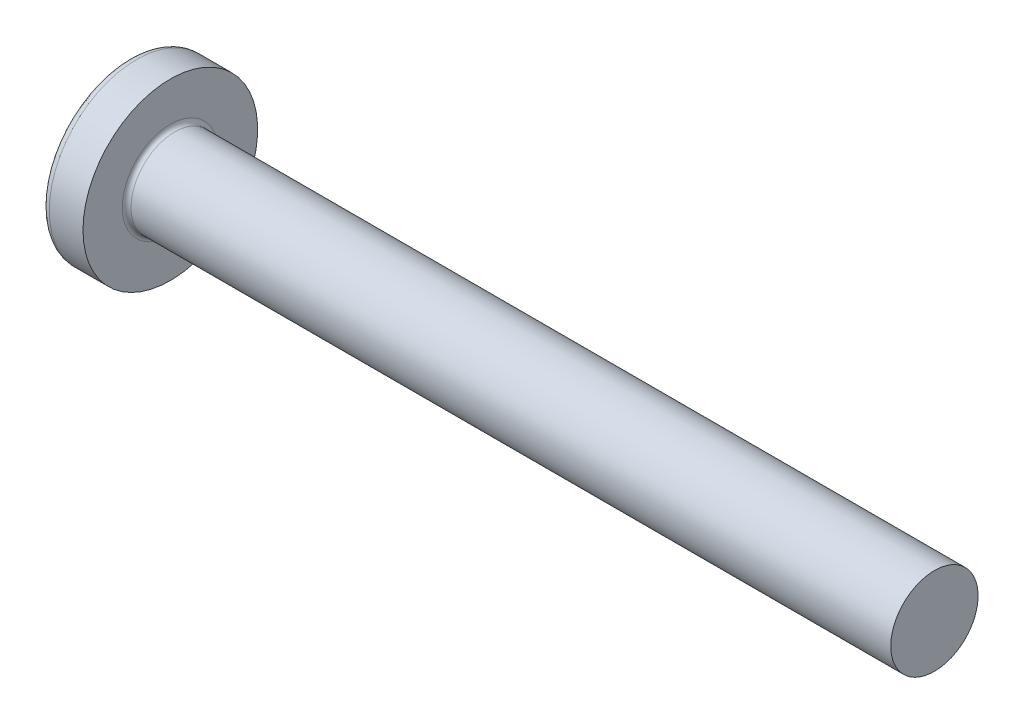
ISO-10303-21;
HEADER;
FILE_DESCRIPTION(('STEP AP214'),'2;1');
FILE_NAME('part.step','',(''),(''),'','','');
FILE_SCHEMA(('AUTOMOTIVE_DESIGN { 1 0 10303 214 1 1 1 1 }'));
ENDSEC;
DATA;
#1=APPLICATION_CONTEXT('core data for automotive mechanical design processes');
#2=APPLICATION_PROTOCOL_DEFINITION('international standard','automotive_design',2000,#1);
#3=PRODUCT_CONTEXT('',#1,'mechanical');
#4=PRODUCT('Part','Part','',(#3));
#5=PRODUCT_RELATED_PRODUCT_CATEGORY('part','',(#4));
#6=PRODUCT_DEFINITION_FORMATION('','',#4);
#7=PRODUCT_DEFINITION_CONTEXT('part definition',#1,'design');
#8=PRODUCT_DEFINITION('design','',#6,#7);
#9=PRODUCT_DEFINITION_SHAPE('','',#8);
#10=(LENGTH_UNIT() NAMED_UNIT(*) SI_UNIT(.MILLI.,.METRE.));
#11=(NAMED_UNIT(*) PLANE_ANGLE_UNIT() SI_UNIT($,.RADIAN.));
#12=(NAMED_UNIT(*) SI_UNIT($,.STERADIAN.) SOLID_ANGLE_UNIT());
#13=UNCERTAINTY_MEASURE_WITH_UNIT(LENGTH_MEASURE(1.E-05),#10,'distance_accuracy_value','');
#14=(GEOMETRIC_REPRESENTATION_CONTEXT(3) GLOBAL_UNCERTAINTY_ASSIGNED_CONTEXT((#13)) GLOBAL_UNIT_ASSIGNED_CONTEXT((#10,
#11,#12)) REPRESENTATION_CONTEXT('',''));
#15=CARTESIAN_POINT('',(0.,0.,0.));
#16=DIRECTION('',(0.,0.,1.));
#17=DIRECTION('',(1.,0.,0.));
#18=AXIS2_PLACEMENT_3D('',#15,#16,#17);
#19=CARTESIAN_POINT('',(6.5,0.,0.));
#20=DIRECTION('',(-1.,0.,0.));
#21=DIRECTION('',(0.,1.,0.));
#22=AXIS2_PLACEMENT_3D('',#19,#20,#21);
#23=SPHERICAL_SURFACE('',#22,6.5);
#24=CARTESIAN_POINT('',(1.26538895452803,0.,0.));
#25=DIRECTION('',(-1.,0.,0.));
#26=DIRECTION('',(0.,0.,1.));
#27=AXIS2_PLACEMENT_3D('',#24,#25,#26);
#28=CIRCLE('',#27,3.85342019543974);
#29=CARTESIAN_POINT('',(1.26538895452803,0.,3.85342019543974));
#30=VERTEX_POINT('',#29);
#31=EDGE_CURVE('E220',#30,#30,#28,.T.);
#32=ORIENTED_EDGE('',*,*,#31,.T.);
#33=EDGE_LOOP('',(#32));
#34=FACE_BOUND('',#33,.T.);
#35=CARTESIAN_POINT('',(0.0788099820016241,0.,0.));
#36=DIRECTION('',(1.,0.,0.));
#37=DIRECTION('',(0.,0.,-1.));
#38=AXIS2_PLACEMENT_3D('',#35,#36,#37);
#39=CIRCLE('',#38,1.0091178091571);
#40=CARTESIAN_POINT('',(0.0788099820016244,-0.514999999999996,-0.867809744562728));
#41=VERTEX_POINT('',#40);
#42=CARTESIAN_POINT('',(0.0788099820016241,-0.867809744562729,-0.515));
#43=VERTEX_POINT('',#42);
#44=EDGE_CURVE('E347',#41,#43,#39,.F.);
#45=ORIENTED_EDGE('',*,*,#44,.F.);
#46=CARTESIAN_POINT('',(6.5,-0.515000000000001,0.));
#47=DIRECTION('',(0.,1.,0.));
#48=DIRECTION('',(0.,0.,1.));
#49=AXIS2_PLACEMENT_3D('',#46,#47,#48);
#50=CIRCLE('',#49,6.47956595768575);
#51=CARTESIAN_POINT('',(0.331830520157854,-0.514999999999992,-1.98455543332603));
#52=VERTEX_POINT('',#51);
#53=EDGE_CURVE('E280',#52,#41,#50,.T.);
#54=ORIENTED_EDGE('',*,*,#53,.F.);
#55=CARTESIAN_POINT('',(6.06443225879603,0.,0.873613881878153));
#56=DIRECTION('',(0.446197753347436,0.,-0.894934391398443));
#57=DIRECTION('',(-0.894934391398442,0.,-0.446197753347436));
#58=AXIS2_PLACEMENT_3D('',#55,#56,#57);
#59=CIRCLE('',#58,6.42628038045433);
#60=CARTESIAN_POINT('',(0.331830520157856,0.515000000000007,-1.98455543332603));
#61=VERTEX_POINT('',#60);
#62=EDGE_CURVE('E254',#52,#61,#59,.T.);
#63=ORIENTED_EDGE('',*,*,#62,.T.);
#64=CARTESIAN_POINT('',(6.5,0.515,0.));
#65=DIRECTION('',(0.,-1.,0.));
#66=DIRECTION('',(0.,0.,-1.));
#67=AXIS2_PLACEMENT_3D('',#64,#65,#66);
#68=CIRCLE('',#67,6.47956595768574);
#69=CARTESIAN_POINT('',(0.0788099820016249,0.515000000000003,-0.867809744562724));
#70=VERTEX_POINT('',#69);
#71=EDGE_CURVE('E309',#70,#61,#68,.T.);
#72=ORIENTED_EDGE('',*,*,#71,.F.);
#73=CARTESIAN_POINT('',(0.0788099820016241,0.867809744562719,-0.515));
#74=VERTEX_POINT('',#73);
#75=EDGE_CURVE('E362',#74,#70,#39,.F.);
#76=ORIENTED_EDGE('',*,*,#75,.F.);
#77=CARTESIAN_POINT('',(6.5,0.,-0.515));
#78=DIRECTION('',(0.,0.,1.));
#79=DIRECTION('',(1.,0.,0.));
#80=AXIS2_PLACEMENT_3D('',#77,#78,#79);
#81=CIRCLE('',#80,6.47956595768574);
#82=CARTESIAN_POINT('',(0.331830520157856,1.98455543332603,-0.515));
#83=VERTEX_POINT('',#82);
#84=EDGE_CURVE('E248',#83,#74,#81,.T.);
#85=ORIENTED_EDGE('',*,*,#84,.F.);
#86=CARTESIAN_POINT('',(6.06443225879604,-0.873613881878154,0.));
#87=DIRECTION('',(0.446197753347436,0.894934391398443,0.));
#88=DIRECTION('',(-0.894934391398442,0.446197753347436,0.));
#89=AXIS2_PLACEMENT_3D('',#86,#87,#88);
#90=CIRCLE('',#89,6.42628038045433);
#91=CARTESIAN_POINT('',(0.331830520157857,1.98455543332603,0.515));
#92=VERTEX_POINT('',#91);
#93=EDGE_CURVE('E251',#83,#92,#90,.T.);
#94=ORIENTED_EDGE('',*,*,#93,.T.);
#95=CARTESIAN_POINT('',(6.5,0.,0.515000000000001));
#96=DIRECTION('',(0.,0.,-1.));
#97=DIRECTION('',(-1.,0.,0.));
#98=AXIS2_PLACEMENT_3D('',#95,#96,#97);
#99=CIRCLE('',#98,6.47956595768574);
#100=CARTESIAN_POINT('',(0.0788099820016241,0.867809744562719,0.514999999999999));
#101=VERTEX_POINT('',#100);
#102=EDGE_CURVE('E244',#101,#92,#99,.T.);
#103=ORIENTED_EDGE('',*,*,#102,.F.);
#104=CARTESIAN_POINT('',(0.0788099820016253,0.514999999999997,0.867809744562727));
#105=VERTEX_POINT('',#104);
#106=EDGE_CURVE('E361',#105,#101,#39,.F.);
#107=ORIENTED_EDGE('',*,*,#106,.F.);
#108=CARTESIAN_POINT('',(0.331830520157856,0.514999999999993,1.98455543332603));
#109=VERTEX_POINT('',#108);
#110=EDGE_CURVE('E264',#109,#105,#68,.T.);
#111=ORIENTED_EDGE('',*,*,#110,.F.);
#112=CARTESIAN_POINT('',(6.06443225879603,0.,-0.873613881878153));
#113=DIRECTION('',(0.446197753347436,0.,0.894934391398443));
#114=DIRECTION('',(0.894934391398442,0.,-0.446197753347436));
#115=AXIS2_PLACEMENT_3D('',#112,#113,#114);
#116=CIRCLE('',#115,6.42628038045433);
#117=CARTESIAN_POINT('',(0.331830520157855,-0.515000000000007,1.98455543332603));
#118=VERTEX_POINT('',#117);
#119=EDGE_CURVE('E53',#109,#118,#116,.T.);
#120=ORIENTED_EDGE('',*,*,#119,.T.);
#121=CARTESIAN_POINT('',(0.0788099820016247,-0.515000000000003,0.867809744562724));
#122=VERTEX_POINT('',#121);
#123=EDGE_CURVE('E261',#122,#118,#50,.T.);
#124=ORIENTED_EDGE('',*,*,#123,.F.);
#125=CARTESIAN_POINT('',(0.0788099820016241,-0.867809744562729,0.514999999999999));
#126=VERTEX_POINT('',#125);
#127=EDGE_CURVE('E397',#126,#122,#39,.F.);
#128=ORIENTED_EDGE('',*,*,#127,.F.);
#129=CARTESIAN_POINT('',(0.331830520157853,-1.98455543332603,0.514999999999999));
#130=VERTEX_POINT('',#129);
#131=EDGE_CURVE('E245',#130,#126,#99,.T.);
#132=ORIENTED_EDGE('',*,*,#131,.F.);
#133=CARTESIAN_POINT('',(6.06443225879603,0.873613881878152,0.));
#134=DIRECTION('',(0.446197753347436,-0.894934391398443,0.));
#135=DIRECTION('',(0.894934391398442,0.446197753347436,0.));
#136=AXIS2_PLACEMENT_3D('',#133,#134,#135);
#137=CIRCLE('',#136,6.42628038045433);
#138=CARTESIAN_POINT('',(0.331830520157853,-1.98455543332603,-0.515));
#139=VERTEX_POINT('',#138);
#140=EDGE_CURVE('E241',#130,#139,#137,.T.);
#141=ORIENTED_EDGE('',*,*,#140,.T.);
#142=EDGE_CURVE('E68',#43,#139,#81,.T.);
#143=ORIENTED_EDGE('',*,*,#142,.F.);
#144=EDGE_LOOP('',(#45,#54,#63,#72,#76,#85,#94,#103,#107,#111,#120,#124,#128,#132,#141,#143));
#145=FACE_BOUND('',#144,.T.);
#146=ADVANCED_FACE('F39',(#34,#145),#23,.T.);
#147=CARTESIAN_POINT('',(0.,2.15,-0.515));
#148=DIRECTION('',(0.,0.,1.));
#149=DIRECTION('',(1.,0.,0.));
#150=AXIS2_PLACEMENT_3D('',#147,#148,#149);
#151=PLANE('',#150);
#152=ORIENTED_EDGE('',*,*,#84,.T.);
#153=CARTESIAN_POINT('',(-1.51195208675156,0.994972220320188,-0.515));
#154=CARTESIAN_POINT('',(-1.20405981949279,0.970722016949958,-0.515));
#155=CARTESIAN_POINT('',(-0.896180907521174,0.946299109919651,-0.515));
#156=CARTESIAN_POINT('',(-0.280449079832185,0.896981122427851,-0.515));
#157=CARTESIAN_POINT('',(0.0274038344396873,0.872086023934883,-0.515));
#158=CARTESIAN_POINT('',(0.489146739515351,0.83429553519528,-0.515));
#159=CARTESIAN_POINT('',(0.643055047553846,0.821624058404092,-0.515));
#160=CARTESIAN_POINT('',(0.950856520197141,0.796108332639504,-0.515));
#161=CARTESIAN_POINT('',(1.10474968487868,0.783264084592465,-0.515));
#162=CARTESIAN_POINT('',(1.41251352095103,0.757376569093378,-0.515));
#163=CARTESIAN_POINT('',(1.56638419296577,0.744333309065218,-0.515));
#164=CARTESIAN_POINT('',(1.87410847343335,0.718013273188896,-0.515));
#165=CARTESIAN_POINT('',(2.02796208151372,0.704736492982792,-0.515));
#166=CARTESIAN_POINT('',(2.36455311890989,0.675386943006726,-0.515));
#167=CARTESIAN_POINT('',(2.54728562293342,0.659257575640986,-0.515));
#168=CARTESIAN_POINT('',(2.91270624109256,0.626517182479888,-0.515));
#169=CARTESIAN_POINT('',(3.09539435554038,0.609906160177238,-0.515));
#170=CARTESIAN_POINT('',(3.46069832191612,0.576073027116421,-0.515));
#171=CARTESIAN_POINT('',(3.64331417870068,0.558850968932727,-0.515));
#172=CARTESIAN_POINT('',(4.00847437496567,0.523604864540037,-0.515));
#173=CARTESIAN_POINT('',(4.19101871216888,0.505580794604253,-0.515));
#174=CARTESIAN_POINT('',(4.55606208157937,0.468429191666488,-0.515));
#175=CARTESIAN_POINT('',(4.73856107358022,0.449301262281854,-0.515));
#176=CARTESIAN_POINT('',(5.10337547353418,0.409473604748924,-0.515));
#177=CARTESIAN_POINT('',(5.28569089526422,0.388774005106069,-0.515));
#178=CARTESIAN_POINT('',(5.55897278495412,0.355828287527264,-0.515));
#179=CARTESIAN_POINT('',(5.65005277419686,0.344527918782738,-0.515));
#180=CARTESIAN_POINT('',(5.83209904103607,0.321075174263031,-0.515));
#181=CARTESIAN_POINT('',(5.92306532397915,0.308922840209686,-0.515));
#182=CARTESIAN_POINT('',(6.10486078872898,0.28342733445193,-0.515));
#183=CARTESIAN_POINT('',(6.19568992299379,0.270083817601714,-0.515));
#184=CARTESIAN_POINT('',(6.33172773785679,0.248701420809951,-0.515));
#185=CARTESIAN_POINT('',(6.37704304473344,0.241345446705304,-0.515));
#186=CARTESIAN_POINT('',(6.4675722520141,0.226018953559337,-0.515));
#187=CARTESIAN_POINT('',(6.51278614568083,0.218048394864476,-0.515));
#188=CARTESIAN_POINT('',(6.55793125759548,0.209691465274944,-0.515));
#189=B_SPLINE_CURVE_WITH_KNOTS('',3,(#153,#154,#155,#156,#157,#158,#159,#160,#161,#162,#163,
#164,#165,#166,#167,#168,#169,#170,#171,#172,#173,#174,#175,#176,#177,#178,#179,#180,#181,#182,
#183,#184,#185,#186,#187,#188),.UNSPECIFIED.,.F.,.F.,(4,2,2,2,2,2,2,2,2,2,2,2,2,2,2,2,2,4),(0.,
0.926537709781721,1.85311087258339,2.31639796016285,2.77968256468771,3.24294992902055,
3.70622594801777,4.25655436065378,4.80687878359543,5.35715597005738,5.90744944680718,
6.45794177197673,7.008389135274,7.28372117336898,7.55903973750591,7.83443833587748,
7.97216007460854,8.10989070671571),.UNSPECIFIED.);
#190=CARTESIAN_POINT('',(2.34,0.677477674908923,-0.515));
#191=VERTEX_POINT('',#190);
#192=EDGE_CURVE('E384',#74,#191,#189,.T.);
#193=ORIENTED_EDGE('',*,*,#192,.T.);
#194=DIRECTION('',(0.,1.,0.));
#195=VECTOR('',#194,1.);
#196=CARTESIAN_POINT('',(2.34,-0.983319232260742,-0.515));
#197=LINE('',#196,#195);
#198=CARTESIAN_POINT('',(2.34,0.983319232260743,-0.515));
#199=VERTEX_POINT('',#198);
#200=EDGE_CURVE('E330',#191,#199,#197,.T.);
#201=ORIENTED_EDGE('',*,*,#200,.T.);
#202=DIRECTION('',(0.894934391398442,-0.446197753347436,0.));
#203=VECTOR('',#202,1.);
#204=CARTESIAN_POINT('',(0.,2.15,-0.515));
#205=LINE('',#204,#203);
#206=EDGE_CURVE('E221',#83,#199,#205,.T.);
#207=ORIENTED_EDGE('',*,*,#206,.F.);
#208=EDGE_LOOP('',(#152,#193,#201,#207));
#209=FACE_BOUND('',#208,.T.);
#210=ADVANCED_FACE('F174',(#209),#151,.T.);
#211=CARTESIAN_POINT('',(2.34,-0.983319232260742,-0.515));
#212=VERTEX_POINT('',#211);
#213=CARTESIAN_POINT('',(2.34,-0.677477674908923,-0.515));
#214=VERTEX_POINT('',#213);
#215=EDGE_CURVE('E229',#212,#214,#197,.T.);
#216=ORIENTED_EDGE('',*,*,#215,.T.);
#217=CARTESIAN_POINT('',(-1.51195208675156,-0.994972220320188,-0.515));
#218=CARTESIAN_POINT('',(-1.20405981949279,-0.970722016949958,-0.515));
#219=CARTESIAN_POINT('',(-0.896180907521174,-0.946299109919651,-0.515));
#220=CARTESIAN_POINT('',(-0.280449079832185,-0.896981122427851,-0.515));
#221=CARTESIAN_POINT('',(0.027403834439687,-0.872086023934883,-0.515));
#222=CARTESIAN_POINT('',(0.48914673951535,-0.83429553519528,-0.515));
#223=CARTESIAN_POINT('',(0.643055047553845,-0.821624058404092,-0.515));
#224=CARTESIAN_POINT('',(0.95085652019714,-0.796108332639504,-0.515));
#225=CARTESIAN_POINT('',(1.10474968487868,-0.783264084592466,-0.515));
#226=CARTESIAN_POINT('',(1.41251352095103,-0.757376569093378,-0.515));
#227=CARTESIAN_POINT('',(1.56638419296577,-0.744333309065218,-0.515));
#228=CARTESIAN_POINT('',(1.87410847343335,-0.718013273188896,-0.515));
#229=CARTESIAN_POINT('',(2.02796208151372,-0.704736492982792,-0.515));
#230=CARTESIAN_POINT('',(2.36455311890989,-0.675386943006726,-0.515));
#231=CARTESIAN_POINT('',(2.54728562293342,-0.659257575640986,-0.515));
#232=CARTESIAN_POINT('',(2.91270624109256,-0.626517182479888,-0.515));
#233=CARTESIAN_POINT('',(3.09539435554038,-0.609906160177238,-0.515));
#234=CARTESIAN_POINT('',(3.46069832191613,-0.576073027116421,-0.515));
#235=CARTESIAN_POINT('',(3.64331417870068,-0.558850968932727,-0.515));
#236=CARTESIAN_POINT('',(4.00847437496567,-0.523604864540037,-0.515));
#237=CARTESIAN_POINT('',(4.19101871216888,-0.505580794604252,-0.515));
#238=CARTESIAN_POINT('',(4.55606208157937,-0.468429191666487,-0.515));
#239=CARTESIAN_POINT('',(4.73856107358023,-0.449301262281853,-0.515));
#240=CARTESIAN_POINT('',(5.10337547353419,-0.409473604748924,-0.515));
#241=CARTESIAN_POINT('',(5.28569089526422,-0.388774005106069,-0.515));
#242=CARTESIAN_POINT('',(5.55897278495412,-0.355828287527264,-0.515));
#243=CARTESIAN_POINT('',(5.65005277419686,-0.344527918782738,-0.515));
#244=CARTESIAN_POINT('',(5.83209904103608,-0.32107517426303,-0.515));
#245=CARTESIAN_POINT('',(5.92306532397915,-0.308922840209685,-0.515));
#246=CARTESIAN_POINT('',(6.10486078872898,-0.283427334451929,-0.515));
#247=CARTESIAN_POINT('',(6.1956899229938,-0.270083817601713,-0.515));
#248=CARTESIAN_POINT('',(6.33172773785679,-0.24870142080995,-0.515));
#249=CARTESIAN_POINT('',(6.37704304473344,-0.241345446705303,-0.515));
#250=CARTESIAN_POINT('',(6.4675722520141,-0.226018953559337,-0.515));
#251=CARTESIAN_POINT('',(6.51278614568083,-0.218048394864475,-0.515));
#252=CARTESIAN_POINT('',(6.55793125759549,-0.209691465274944,-0.515));
#253=B_SPLINE_CURVE_WITH_KNOTS('',3,(#217,#218,#219,#220,#221,#222,#223,#224,#225,#226,#227,
#228,#229,#230,#231,#232,#233,#234,#235,#236,#237,#238,#239,#240,#241,#242,#243,#244,#245,#246,
#247,#248,#249,#250,#251,#252),.UNSPECIFIED.,.F.,.F.,(4,2,2,2,2,2,2,2,2,2,2,2,2,2,2,2,2,4),(0.,
0.926537709781721,1.85311087258339,2.31639796016285,2.77968256468771,3.24294992902054,
3.70622594801777,4.25655436065378,4.80687878359543,5.35715597005738,5.90744944680718,
6.45794177197673,7.008389135274,7.28372117336899,7.55903973750591,7.83443833587749,
7.97216007460855,8.10989070671571),.UNSPECIFIED.);
#254=EDGE_CURVE('E360',#214,#43,#253,.F.);
#255=ORIENTED_EDGE('',*,*,#254,.T.);
#256=ORIENTED_EDGE('',*,*,#142,.T.);
#257=DIRECTION('',(0.894934391398442,0.446197753347436,0.));
#258=VECTOR('',#257,1.);
#259=CARTESIAN_POINT('',(0.,-2.15,-0.515));
#260=LINE('',#259,#258);
#261=EDGE_CURVE('E312',#139,#212,#260,.T.);
#262=ORIENTED_EDGE('',*,*,#261,.T.);
#263=EDGE_LOOP('',(#216,#255,#256,#262));
#264=FACE_BOUND('',#263,.T.);
#265=ADVANCED_FACE('F181',(#264),#151,.T.);
#266=CARTESIAN_POINT('',(0.,-2.15,0.514999999999999));
#267=DIRECTION('',(0.,0.,-1.));
#268=DIRECTION('',(-1.,0.,0.));
#269=AXIS2_PLACEMENT_3D('',#266,#267,#268);
#270=PLANE('',#269);
#271=DIRECTION('',(0.,-1.,0.));
#272=VECTOR('',#271,1.);
#273=CARTESIAN_POINT('',(2.34,0.983319232260742,0.515));
#274=LINE('',#273,#272);
#275=CARTESIAN_POINT('',(2.34,0.983319232260743,0.515));
#276=VERTEX_POINT('',#275);
#277=CARTESIAN_POINT('',(2.34,0.677477674908923,0.515));
#278=VERTEX_POINT('',#277);
#279=EDGE_CURVE('E320',#276,#278,#274,.T.);
#280=ORIENTED_EDGE('',*,*,#279,.T.);
#281=CARTESIAN_POINT('',(-1.51195208675156,0.994972220320188,0.514999999999999));
#282=CARTESIAN_POINT('',(-1.20405981949279,0.970722016949958,0.514999999999999));
#283=CARTESIAN_POINT('',(-0.896180907521173,0.946299109919651,0.514999999999999));
#284=CARTESIAN_POINT('',(-0.280449079832184,0.896981122427852,0.514999999999999));
#285=CARTESIAN_POINT('',(0.0274038344396879,0.872086023934883,0.514999999999999));
#286=CARTESIAN_POINT('',(0.489146739515351,0.83429553519528,0.515));
#287=CARTESIAN_POINT('',(0.643055047553846,0.821624058404092,0.515));
#288=CARTESIAN_POINT('',(0.950856520197141,0.796108332639504,0.515));
#289=CARTESIAN_POINT('',(1.10474968487868,0.783264084592466,0.515));
#290=CARTESIAN_POINT('',(1.41251352095103,0.757376569093379,0.515));
#291=CARTESIAN_POINT('',(1.56638419296577,0.744333309065218,0.515));
#292=CARTESIAN_POINT('',(1.87410847343335,0.718013273188896,0.515));
#293=CARTESIAN_POINT('',(2.02796208151372,0.704736492982792,0.515));
#294=CARTESIAN_POINT('',(2.36455311890989,0.675386943006726,0.515));
#295=CARTESIAN_POINT('',(2.54728562293342,0.659257575640986,0.515));
#296=CARTESIAN_POINT('',(2.91270624109256,0.626517182479888,0.515));
#297=CARTESIAN_POINT('',(3.09539435554038,0.609906160177238,0.515));
#298=CARTESIAN_POINT('',(3.46069832191613,0.576073027116421,0.515));
#299=CARTESIAN_POINT('',(3.64331417870068,0.558850968932727,0.515));
#300=CARTESIAN_POINT('',(4.00847437496567,0.523604864540037,0.515));
#301=CARTESIAN_POINT('',(4.19101871216888,0.505580794604252,0.515));
#302=CARTESIAN_POINT('',(4.55606208157937,0.468429191666487,0.515));
#303=CARTESIAN_POINT('',(4.73856107358023,0.449301262281853,0.515000000000001));
#304=CARTESIAN_POINT('',(5.10337547353419,0.409473604748924,0.515000000000001));
#305=CARTESIAN_POINT('',(5.28569089526422,0.388774005106069,0.515000000000001));
#306=CARTESIAN_POINT('',(5.55897278495412,0.355828287527263,0.515000000000001));
#307=CARTESIAN_POINT('',(5.65005277419686,0.344527918782737,0.515000000000001));
#308=CARTESIAN_POINT('',(5.83209904103608,0.32107517426303,0.515000000000001));
#309=CARTESIAN_POINT('',(5.92306532397915,0.308922840209685,0.515000000000001));
#310=CARTESIAN_POINT('',(6.10486078872898,0.283427334451929,0.515000000000001));
#311=CARTESIAN_POINT('',(6.1956899229938,0.270083817601713,0.515000000000001));
#312=CARTESIAN_POINT('',(6.33172773785679,0.248701420809949,0.515000000000001));
#313=CARTESIAN_POINT('',(6.37704304473344,0.241345446705302,0.515000000000001));
#314=CARTESIAN_POINT('',(6.4675722520141,0.226018953559336,0.515000000000001));
#315=CARTESIAN_POINT('',(6.51278614568083,0.218048394864474,0.515000000000001));
#316=CARTESIAN_POINT('',(6.55793125759549,0.209691465274942,0.515000000000001));
#317=B_SPLINE_CURVE_WITH_KNOTS('',3,(#281,#282,#283,#284,#285,#286,#287,#288,#289,#290,#291,
#292,#293,#294,#295,#296,#297,#298,#299,#300,#301,#302,#303,#304,#305,#306,#307,#308,#309,#310,
#311,#312,#313,#314,#315,#316),.UNSPECIFIED.,.F.,.F.,(4,2,2,2,2,2,2,2,2,2,2,2,2,2,2,2,2,4),(0.,
0.926537709781721,1.85311087258339,2.31639796016285,2.77968256468771,3.24294992902054,
3.70622594801777,4.25655436065378,4.80687878359543,5.35715597005738,5.90744944680718,
6.45794177197673,7.008389135274,7.28372117336899,7.55903973750591,7.83443833587749,
7.97216007460855,8.10989070671571),.UNSPECIFIED.);
#318=EDGE_CURVE('E285',#278,#101,#317,.F.);
#319=ORIENTED_EDGE('',*,*,#318,.T.);
#320=ORIENTED_EDGE('',*,*,#102,.T.);
#321=DIRECTION('',(0.894934391398442,-0.446197753347436,0.));
#322=VECTOR('',#321,1.);
#323=CARTESIAN_POINT('',(0.,2.15,0.515));
#324=LINE('',#323,#322);
#325=EDGE_CURVE('E226',#92,#276,#324,.T.);
#326=ORIENTED_EDGE('',*,*,#325,.T.);
#327=EDGE_LOOP('',(#280,#319,#320,#326));
#328=FACE_BOUND('',#327,.T.);
#329=ADVANCED_FACE('F380',(#328),#270,.T.);
#330=ORIENTED_EDGE('',*,*,#131,.T.);
#331=CARTESIAN_POINT('',(-1.51195208675156,-0.994972220320188,0.514999999999999));
#332=CARTESIAN_POINT('',(-1.20405981949279,-0.970722016949958,0.514999999999999));
#333=CARTESIAN_POINT('',(-0.896180907521174,-0.946299109919651,0.514999999999999));
#334=CARTESIAN_POINT('',(-0.280449079832185,-0.896981122427852,0.514999999999999));
#335=CARTESIAN_POINT('',(0.0274038344396874,-0.872086023934883,0.514999999999999));
#336=CARTESIAN_POINT('',(0.489146739515351,-0.83429553519528,0.514999999999999));
#337=CARTESIAN_POINT('',(0.643055047553846,-0.821624058404092,0.514999999999999));
#338=CARTESIAN_POINT('',(0.950856520197141,-0.796108332639504,0.514999999999999));
#339=CARTESIAN_POINT('',(1.10474968487868,-0.783264084592466,0.515));
#340=CARTESIAN_POINT('',(1.41251352095103,-0.757376569093379,0.515));
#341=CARTESIAN_POINT('',(1.56638419296577,-0.744333309065218,0.515));
#342=CARTESIAN_POINT('',(1.87410847343335,-0.718013273188896,0.515));
#343=CARTESIAN_POINT('',(2.02796208151372,-0.704736492982792,0.515));
#344=CARTESIAN_POINT('',(2.36455311890989,-0.675386943006726,0.515));
#345=CARTESIAN_POINT('',(2.54728562293342,-0.659257575640986,0.515));
#346=CARTESIAN_POINT('',(2.91270624109256,-0.626517182479888,0.515));
#347=CARTESIAN_POINT('',(3.09539435554038,-0.609906160177238,0.515));
#348=CARTESIAN_POINT('',(3.46069832191613,-0.576073027116421,0.515));
#349=CARTESIAN_POINT('',(3.64331417870068,-0.558850968932727,0.515));
#350=CARTESIAN_POINT('',(4.00847437496567,-0.523604864540037,0.515));
#351=CARTESIAN_POINT('',(4.19101871216888,-0.505580794604253,0.515));
#352=CARTESIAN_POINT('',(4.55606208157937,-0.468429191666487,0.515));
#353=CARTESIAN_POINT('',(4.73856107358022,-0.449301262281853,0.515));
#354=CARTESIAN_POINT('',(5.10337547353418,-0.409473604748924,0.515));
#355=CARTESIAN_POINT('',(5.28569089526422,-0.388774005106069,0.515));
#356=CARTESIAN_POINT('',(5.55897278495412,-0.355828287527263,0.515000000000001));
#357=CARTESIAN_POINT('',(5.65005277419686,-0.344527918782738,0.515000000000001));
#358=CARTESIAN_POINT('',(5.83209904103607,-0.32107517426303,0.515000000000001));
#359=CARTESIAN_POINT('',(5.92306532397915,-0.308922840209685,0.515000000000001));
#360=CARTESIAN_POINT('',(6.10486078872898,-0.283427334451929,0.515000000000001));
#361=CARTESIAN_POINT('',(6.19568992299379,-0.270083817601713,0.515000000000001));
#362=CARTESIAN_POINT('',(6.33172773785679,-0.24870142080995,0.515000000000001));
#363=CARTESIAN_POINT('',(6.37704304473344,-0.241345446705303,0.515000000000001));
#364=CARTESIAN_POINT('',(6.4675722520141,-0.226018953559336,0.515000000000001));
#365=CARTESIAN_POINT('',(6.51278614568083,-0.218048394864474,0.515000000000001));
#366=CARTESIAN_POINT('',(6.55793125759549,-0.209691465274943,0.515000000000001));
#367=B_SPLINE_CURVE_WITH_KNOTS('',3,(#331,#332,#333,#334,#335,#336,#337,#338,#339,#340,#341,
#342,#343,#344,#345,#346,#347,#348,#349,#350,#351,#352,#353,#354,#355,#356,#357,#358,#359,#360,
#361,#362,#363,#364,#365,#366),.UNSPECIFIED.,.F.,.F.,(4,2,2,2,2,2,2,2,2,2,2,2,2,2,2,2,2,4),(0.,
0.926537709781721,1.85311087258339,2.31639796016285,2.77968256468771,3.24294992902055,
3.70622594801777,4.25655436065378,4.80687878359543,5.35715597005738,5.90744944680718,
6.45794177197673,7.008389135274,7.28372117336899,7.55903973750591,7.83443833587748,
7.97216007460854,8.10989070671571),.UNSPECIFIED.);
#368=CARTESIAN_POINT('',(2.34,-0.677477674908923,0.515));
#369=VERTEX_POINT('',#368);
#370=EDGE_CURVE('E398',#126,#369,#367,.T.);
#371=ORIENTED_EDGE('',*,*,#370,.T.);
#372=CARTESIAN_POINT('',(2.34,-0.983319232260743,0.515));
#373=VERTEX_POINT('',#372);
#374=EDGE_CURVE('E322',#369,#373,#274,.T.);
#375=ORIENTED_EDGE('',*,*,#374,.T.);
#376=DIRECTION('',(0.894934391398443,0.446197753347436,0.));
#377=VECTOR('',#376,1.);
#378=CARTESIAN_POINT('',(0.,-2.15,0.514999999999999));
#379=LINE('',#378,#377);
#380=EDGE_CURVE('E314',#130,#373,#379,.T.);
#381=ORIENTED_EDGE('',*,*,#380,.F.);
#382=EDGE_LOOP('',(#330,#371,#375,#381));
#383=FACE_BOUND('',#382,.T.);
#384=ADVANCED_FACE('F425',(#383),#270,.T.);
#385=CARTESIAN_POINT('',(2.34,0.983319232260742,-0.515));
#386=DIRECTION('',(-1.,0.,0.));
#387=DIRECTION('',(0.,0.,1.));
#388=AXIS2_PLACEMENT_3D('',#385,#386,#387);
#389=PLANE('',#388);
#390=ORIENTED_EDGE('',*,*,#374,.F.);
#391=CARTESIAN_POINT('',(2.34,0.,0.));
#392=DIRECTION('',(-1.,0.,0.));
#393=DIRECTION('',(0.,0.,1.));
#394=AXIS2_PLACEMENT_3D('',#391,#392,#393);
#395=CIRCLE('',#394,0.851);
#396=EDGE_CURVE('E355',#214,#369,#395,.T.);
#397=ORIENTED_EDGE('',*,*,#396,.F.);
#398=ORIENTED_EDGE('',*,*,#215,.F.);
#399=DIRECTION('',(0.,0.,1.));
#400=VECTOR('',#399,1.);
#401=CARTESIAN_POINT('',(2.34,-0.983319232260742,-0.515));
#402=LINE('',#401,#400);
#403=EDGE_CURVE('E317',#212,#373,#402,.T.);
#404=ORIENTED_EDGE('',*,*,#403,.T.);
#405=EDGE_LOOP('',(#390,#397,#398,#404));
#406=FACE_BOUND('',#405,.T.);
#407=ADVANCED_FACE('F423',(#406),#389,.T.);
#408=DIRECTION('',(0.,0.,-1.));
#409=VECTOR('',#408,1.);
#410=CARTESIAN_POINT('',(2.34,-0.515000000000004,0.983319232260741));
#411=LINE('',#410,#409);
#412=CARTESIAN_POINT('',(2.34,-0.514999999999997,-0.677477674908925));
#413=VERTEX_POINT('',#412);
#414=CARTESIAN_POINT('',(2.34,-0.514999999999996,-0.983319232260744));
#415=VERTEX_POINT('',#414);
#416=EDGE_CURVE('E303',#413,#415,#411,.T.);
#417=ORIENTED_EDGE('',*,*,#416,.F.);
#418=CARTESIAN_POINT('',(2.34,0.515000000000003,-0.677477674908921));
#419=VERTEX_POINT('',#418);
#420=EDGE_CURVE('E60',#419,#413,#395,.T.);
#421=ORIENTED_EDGE('',*,*,#420,.F.);
#422=DIRECTION('',(0.,0.,1.));
#423=VECTOR('',#422,1.);
#424=CARTESIAN_POINT('',(2.34,0.515000000000004,-0.983319232260741));
#425=LINE('',#424,#423);
#426=CARTESIAN_POINT('',(2.34,0.515000000000004,-0.983319232260741));
#427=VERTEX_POINT('',#426);
#428=EDGE_CURVE('E306',#427,#419,#425,.T.);
#429=ORIENTED_EDGE('',*,*,#428,.F.);
#430=DIRECTION('',(0.,-1.,0.));
#431=VECTOR('',#430,1.);
#432=CARTESIAN_POINT('',(2.34,0.515000000000004,-0.983319232260741));
#433=LINE('',#432,#431);
#434=EDGE_CURVE('E297',#427,#415,#433,.T.);
#435=ORIENTED_EDGE('',*,*,#434,.T.);
#436=EDGE_LOOP('',(#417,#421,#429,#435));
#437=FACE_BOUND('',#436,.T.);
#438=ADVANCED_FACE('F350',(#437),#389,.T.);
#439=ORIENTED_EDGE('',*,*,#200,.F.);
#440=EDGE_CURVE('E354',#278,#191,#395,.T.);
#441=ORIENTED_EDGE('',*,*,#440,.F.);
#442=ORIENTED_EDGE('',*,*,#279,.F.);
#443=DIRECTION('',(0.,0.,-1.));
#444=VECTOR('',#443,1.);
#445=CARTESIAN_POINT('',(2.34,0.983319232260742,0.515));
#446=LINE('',#445,#444);
#447=EDGE_CURVE('E323',#276,#199,#446,.T.);
#448=ORIENTED_EDGE('',*,*,#447,.T.);
#449=EDGE_LOOP('',(#439,#441,#442,#448));
#450=FACE_BOUND('',#449,.T.);
#451=ADVANCED_FACE('F432',(#450),#389,.T.);
#452=CARTESIAN_POINT('',(2.34,0.514999999999998,0.677477674908924));
#453=VERTEX_POINT('',#452);
#454=CARTESIAN_POINT('',(2.34,0.514999999999997,0.983319232260744));
#455=VERTEX_POINT('',#454);
#456=EDGE_CURVE('E278',#453,#455,#425,.T.);
#457=ORIENTED_EDGE('',*,*,#456,.F.);
#458=CARTESIAN_POINT('',(2.34,-0.515000000000003,0.677477674908921));
#459=VERTEX_POINT('',#458);
#460=EDGE_CURVE('E358',#459,#453,#395,.T.);
#461=ORIENTED_EDGE('',*,*,#460,.F.);
#462=CARTESIAN_POINT('',(2.34,-0.515000000000004,0.983319232260741));
#463=VERTEX_POINT('',#462);
#464=EDGE_CURVE('E300',#463,#459,#411,.T.);
#465=ORIENTED_EDGE('',*,*,#464,.F.);
#466=DIRECTION('',(0.,1.,0.));
#467=VECTOR('',#466,1.);
#468=CARTESIAN_POINT('',(2.34,-0.515000000000004,0.983319232260741));
#469=LINE('',#468,#467);
#470=EDGE_CURVE('E304',#463,#455,#469,.T.);
#471=ORIENTED_EDGE('',*,*,#470,.T.);
#472=EDGE_LOOP('',(#457,#461,#465,#471));
#473=FACE_BOUND('',#472,.T.);
#474=ADVANCED_FACE('F427',(#473),#389,.T.);
#475=CARTESIAN_POINT('',(0.,0.514999999999993,2.15));
#476=DIRECTION('',(0.,-1.,0.));
#477=DIRECTION('',(1.,0.,0.));
#478=AXIS2_PLACEMENT_3D('',#475,#476,#477);
#479=PLANE('',#478);
#480=ORIENTED_EDGE('',*,*,#110,.T.);
#481=CARTESIAN_POINT('',(-1.51195208675156,0.514999999999997,0.994972220320189));
#482=CARTESIAN_POINT('',(-1.20405981949279,0.514999999999997,0.97072201694996));
#483=CARTESIAN_POINT('',(-0.896180907521173,0.514999999999997,0.946299109919652));
#484=CARTESIAN_POINT('',(-0.280449079832184,0.514999999999997,0.896981122427853));
#485=CARTESIAN_POINT('',(0.0274038344396879,0.514999999999997,0.872086023934884));
#486=CARTESIAN_POINT('',(0.489146739515351,0.514999999999997,0.834295535195282));
#487=CARTESIAN_POINT('',(0.643055047553846,0.514999999999997,0.821624058404094));
#488=CARTESIAN_POINT('',(0.950856520197141,0.514999999999997,0.796108332639506));
#489=CARTESIAN_POINT('',(1.10474968487868,0.514999999999997,0.783264084592467));
#490=CARTESIAN_POINT('',(1.41251352095103,0.514999999999997,0.75737656909338));
#491=CARTESIAN_POINT('',(1.56638419296577,0.514999999999997,0.74433330906522));
#492=CARTESIAN_POINT('',(1.87410847343335,0.514999999999998,0.718013273188897));
#493=CARTESIAN_POINT('',(2.02796208151372,0.514999999999998,0.704736492982794));
#494=CARTESIAN_POINT('',(2.36455311890989,0.514999999999998,0.675386943006728));
#495=CARTESIAN_POINT('',(2.54728562293342,0.514999999999998,0.659257575640987));
#496=CARTESIAN_POINT('',(2.91270624109256,0.514999999999998,0.626517182479889));
#497=CARTESIAN_POINT('',(3.09539435554038,0.514999999999998,0.60990616017724));
#498=CARTESIAN_POINT('',(3.46069832191613,0.514999999999998,0.576073027116423));
#499=CARTESIAN_POINT('',(3.64331417870068,0.514999999999998,0.558850968932729));
#500=CARTESIAN_POINT('',(4.00847437496567,0.514999999999998,0.523604864540039));
#501=CARTESIAN_POINT('',(4.19101871216888,0.514999999999998,0.505580794604254));
#502=CARTESIAN_POINT('',(4.55606208157937,0.514999999999999,0.468429191666489));
#503=CARTESIAN_POINT('',(4.73856107358023,0.514999999999999,0.449301262281855));
#504=CARTESIAN_POINT('',(5.10337547353419,0.514999999999999,0.409473604748926));
#505=CARTESIAN_POINT('',(5.28569089526422,0.514999999999999,0.388774005106071));
#506=CARTESIAN_POINT('',(5.55897278495412,0.514999999999999,0.355828287527265));
#507=CARTESIAN_POINT('',(5.65005277419686,0.514999999999999,0.344527918782739));
#508=CARTESIAN_POINT('',(5.83209904103608,0.514999999999999,0.321075174263032));
#509=CARTESIAN_POINT('',(5.92306532397915,0.514999999999999,0.308922840209687));
#510=CARTESIAN_POINT('',(6.10486078872898,0.514999999999999,0.283427334451931));
#511=CARTESIAN_POINT('',(6.19568992299379,0.514999999999999,0.270083817601715));
#512=CARTESIAN_POINT('',(6.33172773785679,0.514999999999999,0.248701420809952));
#513=CARTESIAN_POINT('',(6.37704304473344,0.514999999999999,0.241345446705305));
#514=CARTESIAN_POINT('',(6.4675722520141,0.514999999999999,0.226018953559339));
#515=CARTESIAN_POINT('',(6.51278614568083,0.514999999999999,0.218048394864478));
#516=CARTESIAN_POINT('',(6.55793125759549,0.515,0.209691465274946));
#517=B_SPLINE_CURVE_WITH_KNOTS('',3,(#481,#482,#483,#484,#485,#486,#487,#488,#489,#490,#491,
#492,#493,#494,#495,#496,#497,#498,#499,#500,#501,#502,#503,#504,#505,#506,#507,#508,#509,#510,
#511,#512,#513,#514,#515,#516),.UNSPECIFIED.,.F.,.F.,(4,2,2,2,2,2,2,2,2,2,2,2,2,2,2,2,2,4),(0.,
0.926537709781721,1.85311087258339,2.31639796016285,2.77968256468771,3.24294992902054,
3.70622594801777,4.25655436065378,4.80687878359543,5.35715597005738,5.90744944680718,
6.45794177197673,7.008389135274,7.28372117336899,7.55903973750591,7.83443833587748,
7.97216007460854,8.10989070671571),.UNSPECIFIED.);
#518=EDGE_CURVE('E446',#105,#453,#517,.T.);
#519=ORIENTED_EDGE('',*,*,#518,.T.);
#520=ORIENTED_EDGE('',*,*,#456,.T.);
#521=DIRECTION('',(0.894934391398442,0.,-0.446197753347436));
#522=VECTOR('',#521,1.);
#523=CARTESIAN_POINT('',(0.,0.514999999999993,2.15));
#524=LINE('',#523,#522);
#525=EDGE_CURVE('E271',#109,#455,#524,.T.);
#526=ORIENTED_EDGE('',*,*,#525,.F.);
#527=EDGE_LOOP('',(#480,#519,#520,#526));
#528=FACE_BOUND('',#527,.T.);
#529=ADVANCED_FACE('F275',(#528),#479,.T.);
#530=CARTESIAN_POINT('',(0.,-0.514999999999992,-2.15));
#531=DIRECTION('',(0.,1.,0.));
#532=DIRECTION('',(-1.,0.,0.));
#533=AXIS2_PLACEMENT_3D('',#530,#531,#532);
#534=PLANE('',#533);
#535=ORIENTED_EDGE('',*,*,#464,.T.);
#536=CARTESIAN_POINT('',(-1.51195208754037,-0.515000000000003,0.994972220382296));
#537=CARTESIAN_POINT('',(-1.20405982018868,-0.515000000000003,0.970722017005062));
#538=CARTESIAN_POINT('',(-0.896180908124144,-0.515000000000003,0.946299109967687));
#539=CARTESIAN_POINT('',(-0.280449080249313,-0.515000000000003,0.896981122461526));
#540=CARTESIAN_POINT('',(0.027403834115485,-0.515000000000003,0.872086023961263));
#541=CARTESIAN_POINT('',(0.489146739371409,-0.515000000000003,0.834295535207135));
#542=CARTESIAN_POINT('',(0.643055047497245,-0.515000000000003,0.821624058408794));
#543=CARTESIAN_POINT('',(0.950856520315204,-0.515000000000003,0.796108332629704));
#544=CARTESIAN_POINT('',(1.10474968508407,-0.515000000000003,0.783264084575316));
#545=CARTESIAN_POINT('',(1.41251352133103,-0.515000000000003,0.757376569061286));
#546=CARTESIAN_POINT('',(1.56638419343305,-0.515000000000003,0.744333309025532));
#547=CARTESIAN_POINT('',(1.87410847407519,-0.515000000000003,0.718013273133714));
#548=CARTESIAN_POINT('',(2.02796208224283,-0.515000000000002,0.704736492919708));
#549=CARTESIAN_POINT('',(2.36455311972626,-0.515000000000002,0.675386942934954));
#550=CARTESIAN_POINT('',(2.5472856237498,-0.515000000000002,0.659257575568566));
#551=CARTESIAN_POINT('',(2.91270624190895,-0.515000000000002,0.626517182406012));
#552=CARTESIAN_POINT('',(3.09539435635676,-0.515000000000002,0.609906160102553));
#553=CARTESIAN_POINT('',(3.46069832273244,-0.515000000000002,0.576073027039887));
#554=CARTESIAN_POINT('',(3.64331417951694,-0.515000000000002,0.558850968855155));
#555=CARTESIAN_POINT('',(4.00847437578178,-0.515000000000002,0.523604864460042));
#556=CARTESIAN_POINT('',(4.1910187129849,-0.515000000000002,0.505580794522874));
#557=CARTESIAN_POINT('',(4.55606208239526,-0.515000000000002,0.468429191581778));
#558=CARTESIAN_POINT('',(4.73856107439606,-0.515000000000002,0.449301262195196));
#559=CARTESIAN_POINT('',(5.10337547434977,-0.515000000000002,0.409473604657433));
#560=CARTESIAN_POINT('',(5.28569089607961,-0.515000000000002,0.388774005011692));
#561=CARTESIAN_POINT('',(5.55897278576906,-0.515000000000002,0.35582828742708));
#562=CARTESIAN_POINT('',(5.65005277501166,-0.515000000000002,0.344527918680366));
#563=CARTESIAN_POINT('',(5.83209904185046,-0.515000000000002,0.321075174155497));
#564=CARTESIAN_POINT('',(5.92306532479326,-0.515000000000002,0.308922840099178));
#565=CARTESIAN_POINT('',(6.10486078954238,-0.515000000000002,0.28342733433415));
#566=CARTESIAN_POINT('',(6.19568992380676,-0.515000000000002,0.270083817479634));
#567=CARTESIAN_POINT('',(6.33172773866873,-0.515000000000002,0.248701420679476));
#568=CARTESIAN_POINT('',(6.37704304554499,-0.515000000000002,0.241345446571704));
#569=CARTESIAN_POINT('',(6.46757225282465,-0.515000000000002,0.22601895341842));
#570=CARTESIAN_POINT('',(6.51278614649077,-0.515000000000002,0.218048394719365));
#571=CARTESIAN_POINT('',(6.55793125840465,-0.515000000000002,0.209691465124898));
#572=B_SPLINE_CURVE_WITH_KNOTS('',3,(#536,#537,#538,#539,#540,#541,#542,#543,#544,#545,#546,
#547,#548,#549,#550,#551,#552,#553,#554,#555,#556,#557,#558,#559,#560,#561,#562,#563,#564,#565,
#566,#567,#568,#569,#570,#571),.UNSPECIFIED.,.F.,.F.,(4,2,2,2,2,2,2,2,2,2,2,2,2,2,2,2,2,4),(0.,
0.926537710061278,1.85311087314258,2.31639796098494,2.77968256577269,3.24294993036838,
3.70622594962848,4.25655436226469,4.80687878520654,5.3571559716686,5.90744944841854,
6.45794177358856,7.00838913688618,7.28372117498157,7.55903973911884,7.83443833749096,
7.97216007622236,8.10989070832989),.UNSPECIFIED.);
#573=EDGE_CURVE('E390',#459,#122,#572,.F.);
#574=ORIENTED_EDGE('',*,*,#573,.T.);
#575=ORIENTED_EDGE('',*,*,#123,.T.);
#576=DIRECTION('',(0.894934391398442,0.,-0.446197753347436));
#577=VECTOR('',#576,1.);
#578=CARTESIAN_POINT('',(0.,-0.515000000000007,2.15));
#579=LINE('',#578,#577);
#580=EDGE_CURVE('E273',#118,#463,#579,.T.);
#581=ORIENTED_EDGE('',*,*,#580,.T.);
#582=EDGE_LOOP('',(#535,#574,#575,#581));
#583=FACE_BOUND('',#582,.T.);
#584=ADVANCED_FACE('F211',(#583),#534,.T.);
#585=ORIENTED_EDGE('',*,*,#428,.T.);
#586=CARTESIAN_POINT('',(-1.51195208754037,0.515000000000004,-0.994972220382296));
#587=CARTESIAN_POINT('',(-1.20405982018868,0.515000000000003,-0.970722017005062));
#588=CARTESIAN_POINT('',(-0.896180908124144,0.515000000000003,-0.946299109967687));
#589=CARTESIAN_POINT('',(-0.280449080249312,0.515000000000003,-0.896981122461525));
#590=CARTESIAN_POINT('',(0.0274038341154851,0.515000000000003,-0.872086023961263));
#591=CARTESIAN_POINT('',(0.489146739371408,0.515000000000003,-0.834295535207134));
#592=CARTESIAN_POINT('',(0.643055047497245,0.515000000000003,-0.821624058408794));
#593=CARTESIAN_POINT('',(0.950856520315203,0.515000000000003,-0.796108332629704));
#594=CARTESIAN_POINT('',(1.10474968508407,0.515000000000003,-0.783264084575316));
#595=CARTESIAN_POINT('',(1.41251352133103,0.515000000000003,-0.757376569061286));
#596=CARTESIAN_POINT('',(1.56638419343305,0.515000000000003,-0.744333309025532));
#597=CARTESIAN_POINT('',(1.87410847407519,0.515000000000003,-0.718013273133714));
#598=CARTESIAN_POINT('',(2.02796208224283,0.515000000000003,-0.704736492919708));
#599=CARTESIAN_POINT('',(2.36455311972626,0.515000000000002,-0.675386942934954));
#600=CARTESIAN_POINT('',(2.5472856237498,0.515000000000002,-0.659257575568566));
#601=CARTESIAN_POINT('',(2.91270624190895,0.515000000000002,-0.626517182406012));
#602=CARTESIAN_POINT('',(3.09539435635676,0.515000000000002,-0.609906160102552));
#603=CARTESIAN_POINT('',(3.46069832273244,0.515000000000002,-0.576073027039887));
#604=CARTESIAN_POINT('',(3.64331417951694,0.515000000000002,-0.558850968855155));
#605=CARTESIAN_POINT('',(4.00847437578178,0.515000000000002,-0.523604864460042));
#606=CARTESIAN_POINT('',(4.1910187129849,0.515000000000002,-0.505580794522874));
#607=CARTESIAN_POINT('',(4.55606208239526,0.515000000000002,-0.468429191581778));
#608=CARTESIAN_POINT('',(4.73856107439606,0.515000000000002,-0.449301262195196));
#609=CARTESIAN_POINT('',(5.10337547434977,0.515000000000002,-0.409473604657433));
#610=CARTESIAN_POINT('',(5.28569089607961,0.515000000000002,-0.388774005011693));
#611=CARTESIAN_POINT('',(5.55897278576906,0.515000000000002,-0.35582828742708));
#612=CARTESIAN_POINT('',(5.65005277501166,0.515000000000001,-0.344527918680367));
#613=CARTESIAN_POINT('',(5.83209904185046,0.515000000000001,-0.321075174155498));
#614=CARTESIAN_POINT('',(5.92306532479326,0.515000000000001,-0.308922840099179));
#615=CARTESIAN_POINT('',(6.10486078954238,0.515000000000001,-0.283427334334151));
#616=CARTESIAN_POINT('',(6.19568992380675,0.515000000000001,-0.270083817479635));
#617=CARTESIAN_POINT('',(6.33172773866873,0.515000000000001,-0.248701420679477));
#618=CARTESIAN_POINT('',(6.37704304554499,0.515000000000001,-0.241345446571705));
#619=CARTESIAN_POINT('',(6.46757225282465,0.515000000000001,-0.226018953418421));
#620=CARTESIAN_POINT('',(6.51278614649077,0.515000000000001,-0.218048394719367));
#621=CARTESIAN_POINT('',(6.55793125840465,0.515000000000001,-0.209691465124899));
#622=B_SPLINE_CURVE_WITH_KNOTS('',3,(#586,#587,#588,#589,#590,#591,#592,#593,#594,#595,#596,
#597,#598,#599,#600,#601,#602,#603,#604,#605,#606,#607,#608,#609,#610,#611,#612,#613,#614,#615,
#616,#617,#618,#619,#620,#621),.UNSPECIFIED.,.F.,.F.,(4,2,2,2,2,2,2,2,2,2,2,2,2,2,2,2,2,4),(0.,
0.926537710061278,1.85311087314258,2.31639796098494,2.77968256577269,3.24294993036838,
3.70622594962848,4.25655436226469,4.80687878520654,5.3571559716686,5.90744944841855,
6.45794177358856,7.00838913688618,7.28372117498156,7.55903973911884,7.83443833749096,
7.97216007622236,8.10989070832989),.UNSPECIFIED.);
#623=EDGE_CURVE('E339',#419,#70,#622,.F.);
#624=ORIENTED_EDGE('',*,*,#623,.T.);
#625=ORIENTED_EDGE('',*,*,#71,.T.);
#626=DIRECTION('',(0.894934391398442,0.,0.446197753347436));
#627=VECTOR('',#626,1.);
#628=CARTESIAN_POINT('',(0.,0.515000000000008,-2.15));
#629=LINE('',#628,#627);
#630=EDGE_CURVE('E282',#61,#427,#629,.T.);
#631=ORIENTED_EDGE('',*,*,#630,.T.);
#632=EDGE_LOOP('',(#585,#624,#625,#631));
#633=FACE_BOUND('',#632,.T.);
#634=ADVANCED_FACE('F209',(#633),#479,.T.);
#635=ORIENTED_EDGE('',*,*,#53,.T.);
#636=CARTESIAN_POINT('',(-1.51195208675156,-0.514999999999996,-0.99497222032019));
#637=CARTESIAN_POINT('',(-1.20405981949279,-0.514999999999996,-0.97072201694996));
#638=CARTESIAN_POINT('',(-0.896180907521174,-0.514999999999996,-0.946299109919653));
#639=CARTESIAN_POINT('',(-0.280449079832186,-0.514999999999996,-0.896981122427854));
#640=CARTESIAN_POINT('',(0.0274038344396869,-0.514999999999996,-0.872086023934885));
#641=CARTESIAN_POINT('',(0.48914673951535,-0.514999999999997,-0.834295535195282));
#642=CARTESIAN_POINT('',(0.643055047553845,-0.514999999999997,-0.821624058404094));
#643=CARTESIAN_POINT('',(0.95085652019714,-0.514999999999997,-0.796108332639506));
#644=CARTESIAN_POINT('',(1.10474968487868,-0.514999999999997,-0.783264084592468));
#645=CARTESIAN_POINT('',(1.41251352095103,-0.514999999999997,-0.757376569093381));
#646=CARTESIAN_POINT('',(1.56638419296577,-0.514999999999997,-0.74433330906522));
#647=CARTESIAN_POINT('',(1.87410847343335,-0.514999999999997,-0.718013273188898));
#648=CARTESIAN_POINT('',(2.02796208151372,-0.514999999999997,-0.704736492982794));
#649=CARTESIAN_POINT('',(2.36455311890989,-0.514999999999998,-0.675386943006728));
#650=CARTESIAN_POINT('',(2.54728562293342,-0.514999999999998,-0.659257575640988));
#651=CARTESIAN_POINT('',(2.91270624109256,-0.514999999999998,-0.62651718247989));
#652=CARTESIAN_POINT('',(3.09539435554038,-0.514999999999998,-0.60990616017724));
#653=CARTESIAN_POINT('',(3.46069832191612,-0.514999999999998,-0.576073027116423));
#654=CARTESIAN_POINT('',(3.64331417870068,-0.514999999999998,-0.558850968932729));
#655=CARTESIAN_POINT('',(4.00847437496567,-0.514999999999998,-0.523604864540039));
#656=CARTESIAN_POINT('',(4.19101871216888,-0.514999999999999,-0.505580794604254));
#657=CARTESIAN_POINT('',(4.55606208157937,-0.514999999999999,-0.468429191666489));
#658=CARTESIAN_POINT('',(4.73856107358022,-0.514999999999999,-0.449301262281855));
#659=CARTESIAN_POINT('',(5.10337547353418,-0.514999999999999,-0.409473604748926));
#660=CARTESIAN_POINT('',(5.28569089526422,-0.514999999999999,-0.388774005106071));
#661=CARTESIAN_POINT('',(5.55897278495412,-0.514999999999999,-0.355828287527265));
#662=CARTESIAN_POINT('',(5.65005277419686,-0.514999999999999,-0.34452791878274));
#663=CARTESIAN_POINT('',(5.83209904103607,-0.515,-0.321075174263032));
#664=CARTESIAN_POINT('',(5.92306532397915,-0.515,-0.308922840209687));
#665=CARTESIAN_POINT('',(6.10486078872898,-0.515,-0.283427334451931));
#666=CARTESIAN_POINT('',(6.19568992299379,-0.515,-0.270083817601715));
#667=CARTESIAN_POINT('',(6.33172773785679,-0.515,-0.248701420809951));
#668=CARTESIAN_POINT('',(6.37704304473344,-0.515,-0.241345446705304));
#669=CARTESIAN_POINT('',(6.4675722520141,-0.515,-0.226018953559338));
#670=CARTESIAN_POINT('',(6.51278614568083,-0.515,-0.218048394864476));
#671=CARTESIAN_POINT('',(6.55793125759548,-0.515,-0.209691465274945));
#672=B_SPLINE_CURVE_WITH_KNOTS('',3,(#636,#637,#638,#639,#640,#641,#642,#643,#644,#645,#646,
#647,#648,#649,#650,#651,#652,#653,#654,#655,#656,#657,#658,#659,#660,#661,#662,#663,#664,#665,
#666,#667,#668,#669,#670,#671),.UNSPECIFIED.,.F.,.F.,(4,2,2,2,2,2,2,2,2,2,2,2,2,2,2,2,2,4),(0.,
0.926537709781721,1.85311087258339,2.31639796016285,2.77968256468771,3.24294992902054,
3.70622594801777,4.25655436065378,4.80687878359543,5.35715597005738,5.90744944680718,
6.45794177197673,7.008389135274,7.28372117336899,7.55903973750591,7.83443833587749,
7.97216007460855,8.10989070671571),.UNSPECIFIED.);
#673=EDGE_CURVE('E11',#41,#413,#672,.T.);
#674=ORIENTED_EDGE('',*,*,#673,.T.);
#675=ORIENTED_EDGE('',*,*,#416,.T.);
#676=DIRECTION('',(0.894934391398443,0.,0.446197753347436));
#677=VECTOR('',#676,1.);
#678=CARTESIAN_POINT('',(0.,-0.514999999999992,-2.15));
#679=LINE('',#678,#677);
#680=EDGE_CURVE('E294',#52,#415,#679,.T.);
#681=ORIENTED_EDGE('',*,*,#680,.F.);
#682=EDGE_LOOP('',(#635,#674,#675,#681));
#683=FACE_BOUND('',#682,.T.);
#684=ADVANCED_FACE('F203',(#683),#534,.T.);
#685=CARTESIAN_POINT('',(-25.4,0.,0.));
#686=DIRECTION('',(-1.,0.,0.));
#687=DIRECTION('',(0.,0.,1.));
#688=AXIS2_PLACEMENT_3D('',#685,#686,#687);
#689=CYLINDRICAL_SURFACE('',#688,2.);
#690=CARTESIAN_POINT('',(3.3,0.,0.));
#691=DIRECTION('',(-1.,0.,0.));
#692=DIRECTION('',(0.,0.,1.));
#693=AXIS2_PLACEMENT_3D('',#690,#691,#692);
#694=CIRCLE('',#693,2.);
#695=CARTESIAN_POINT('',(3.3,0.,2.));
#696=VERTEX_POINT('',#695);
#697=EDGE_CURVE('E215',#696,#696,#694,.F.);
#698=ORIENTED_EDGE('',*,*,#697,.T.);
#699=EDGE_LOOP('',(#698));
#700=FACE_BOUND('',#699,.T.);
#701=CARTESIAN_POINT('',(38.1,0.,0.));
#702=DIRECTION('',(-1.,0.,0.));
#703=DIRECTION('',(0.,0.,1.));
#704=AXIS2_PLACEMENT_3D('',#701,#702,#703);
#705=CIRCLE('',#704,2.);
#706=CARTESIAN_POINT('',(38.1,0.,2.));
#707=VERTEX_POINT('',#706);
#708=EDGE_CURVE('E218',#707,#707,#705,.T.);
#709=ORIENTED_EDGE('',*,*,#708,.T.);
#710=EDGE_LOOP('',(#709));
#711=FACE_BOUND('',#710,.T.);
#712=ADVANCED_FACE('F200',(#700,#711),#689,.T.);
#713=CARTESIAN_POINT('',(3.1,2.,0.));
#714=DIRECTION('',(-1.,0.,0.));
#715=DIRECTION('',(0.,0.,1.));
#716=AXIS2_PLACEMENT_3D('',#713,#714,#715);
#717=PLANE('',#716);
#718=CARTESIAN_POINT('',(3.1,0.,0.));
#719=DIRECTION('',(-1.,0.,0.));
#720=DIRECTION('',(0.,0.,1.));
#721=AXIS2_PLACEMENT_3D('',#718,#719,#720);
#722=CIRCLE('',#721,2.2);
#723=CARTESIAN_POINT('',(3.1,0.,2.2));
#724=VERTEX_POINT('',#723);
#725=EDGE_CURVE('E237',#724,#724,#722,.T.);
#726=ORIENTED_EDGE('',*,*,#725,.T.);
#727=EDGE_LOOP('',(#726));
#728=FACE_BOUND('',#727,.T.);
#729=CARTESIAN_POINT('',(3.1,0.,0.));
#730=DIRECTION('',(-1.,0.,0.));
#731=DIRECTION('',(0.,0.,1.));
#732=AXIS2_PLACEMENT_3D('',#729,#730,#731);
#733=CIRCLE('',#732,4.);
#734=CARTESIAN_POINT('',(3.1,0.,4.));
#735=VERTEX_POINT('',#734);
#736=EDGE_CURVE('E234',#735,#735,#733,.T.);
#737=ORIENTED_EDGE('',*,*,#736,.F.);
#738=EDGE_LOOP('',(#737));
#739=FACE_BOUND('',#738,.T.);
#740=ADVANCED_FACE('F197',(#728,#739),#717,.F.);
#741=CARTESIAN_POINT('',(-25.4,0.,0.));
#742=DIRECTION('',(-1.,0.,0.));
#743=DIRECTION('',(0.,0.,1.));
#744=AXIS2_PLACEMENT_3D('',#741,#742,#743);
#745=CYLINDRICAL_SURFACE('',#744,4.);
#746=ORIENTED_EDGE('',*,*,#736,.T.);
#747=EDGE_LOOP('',(#746));
#748=FACE_BOUND('',#747,.T.);
#749=CARTESIAN_POINT('',(1.55530587396956,0.,0.));
#750=DIRECTION('',(-1.,0.,0.));
#751=DIRECTION('',(0.,0.,1.));
#752=AXIS2_PLACEMENT_3D('',#749,#750,#751);
#753=CIRCLE('',#752,4.);
#754=CARTESIAN_POINT('',(1.55530587396956,0.,4.));
#755=VERTEX_POINT('',#754);
#756=EDGE_CURVE('E223',#755,#755,#753,.T.);
#757=ORIENTED_EDGE('',*,*,#756,.F.);
#758=EDGE_LOOP('',(#757));
#759=FACE_BOUND('',#758,.T.);
#760=ADVANCED_FACE('F193',(#748,#759),#745,.T.);
#761=CARTESIAN_POINT('',(1.55530587396956,0.,0.));
#762=DIRECTION('',(-1.,0.,0.));
#763=DIRECTION('',(0.,0.,1.));
#764=AXIS2_PLACEMENT_3D('',#761,#762,#763);
#765=TOROIDAL_SURFACE('',#764,3.64,0.36);
#766=ORIENTED_EDGE('',*,*,#756,.T.);
#767=EDGE_LOOP('',(#766));
#768=FACE_BOUND('',#767,.T.);
#769=ORIENTED_EDGE('',*,*,#31,.F.);
#770=EDGE_LOOP('',(#769));
#771=FACE_BOUND('',#770,.T.);
#772=ADVANCED_FACE('F190',(#768,#771),#765,.T.);
#773=CARTESIAN_POINT('',(38.1,2.,0.));
#774=DIRECTION('',(1.,0.,0.));
#775=DIRECTION('',(0.,0.,-1.));
#776=AXIS2_PLACEMENT_3D('',#773,#774,#775);
#777=PLANE('',#776);
#778=ORIENTED_EDGE('',*,*,#708,.F.);
#779=EDGE_LOOP('',(#778));
#780=FACE_BOUND('',#779,.T.);
#781=ADVANCED_FACE('F188',(#780),#777,.T.);
#782=CARTESIAN_POINT('',(3.3,0.,0.));
#783=DIRECTION('',(-1.,0.,0.));
#784=DIRECTION('',(0.,0.,1.));
#785=AXIS2_PLACEMENT_3D('',#782,#783,#784);
#786=TOROIDAL_SURFACE('',#785,2.2,0.2);
#787=ORIENTED_EDGE('',*,*,#697,.F.);
#788=EDGE_LOOP('',(#787));
#789=FACE_BOUND('',#788,.T.);
#790=ORIENTED_EDGE('',*,*,#725,.F.);
#791=EDGE_LOOP('',(#790));
#792=FACE_BOUND('',#791,.T.);
#793=ADVANCED_FACE('F41',(#789,#792),#786,.F.);
#794=CARTESIAN_POINT('',(2.34,0.983319232260742,0.515));
#795=DIRECTION('',(0.446197753347436,0.894934391398443,0.));
#796=DIRECTION('',(-0.894934391398442,0.446197753347436,0.));
#797=AXIS2_PLACEMENT_3D('',#794,#795,#796);
#798=PLANE('',#797);
#799=ORIENTED_EDGE('',*,*,#206,.T.);
#800=ORIENTED_EDGE('',*,*,#447,.F.);
#801=ORIENTED_EDGE('',*,*,#325,.F.);
#802=ORIENTED_EDGE('',*,*,#93,.F.);
#803=EDGE_LOOP('',(#799,#800,#801,#802));
#804=FACE_BOUND('',#803,.T.);
#805=ADVANCED_FACE('F378',(#804),#798,.F.);
#806=CARTESIAN_POINT('',(0.,-2.15,-0.515));
#807=DIRECTION('',(0.446197753347436,-0.894934391398443,0.));
#808=DIRECTION('',(0.894934391398442,0.446197753347436,0.));
#809=AXIS2_PLACEMENT_3D('',#806,#807,#808);
#810=PLANE('',#809);
#811=ORIENTED_EDGE('',*,*,#380,.T.);
#812=ORIENTED_EDGE('',*,*,#403,.F.);
#813=ORIENTED_EDGE('',*,*,#261,.F.);
#814=ORIENTED_EDGE('',*,*,#140,.F.);
#815=EDGE_LOOP('',(#811,#812,#813,#814));
#816=FACE_BOUND('',#815,.T.);
#817=ADVANCED_FACE('F414',(#816),#810,.F.);
#818=CARTESIAN_POINT('',(2.34,-0.515000000000004,0.983319232260741));
#819=DIRECTION('',(0.446197753347436,0.,0.894934391398443));
#820=DIRECTION('',(-0.894934391398442,0.,0.446197753347436));
#821=AXIS2_PLACEMENT_3D('',#818,#819,#820);
#822=PLANE('',#821);
#823=ORIENTED_EDGE('',*,*,#525,.T.);
#824=ORIENTED_EDGE('',*,*,#470,.F.);
#825=ORIENTED_EDGE('',*,*,#580,.F.);
#826=ORIENTED_EDGE('',*,*,#119,.F.);
#827=EDGE_LOOP('',(#823,#824,#825,#826));
#828=FACE_BOUND('',#827,.T.);
#829=ADVANCED_FACE('F269',(#828),#822,.F.);
#830=CARTESIAN_POINT('',(0.,0.515000000000008,-2.15));
#831=DIRECTION('',(0.446197753347436,0.,-0.894934391398443));
#832=DIRECTION('',(0.894934391398442,0.,0.446197753347436));
#833=AXIS2_PLACEMENT_3D('',#830,#831,#832);
#834=PLANE('',#833);
#835=ORIENTED_EDGE('',*,*,#680,.T.);
#836=ORIENTED_EDGE('',*,*,#434,.F.);
#837=ORIENTED_EDGE('',*,*,#630,.F.);
#838=ORIENTED_EDGE('',*,*,#62,.F.);
#839=EDGE_LOOP('',(#835,#836,#837,#838));
#840=FACE_BOUND('',#839,.T.);
#841=ADVANCED_FACE('F342',(#840),#834,.F.);
#842=CARTESIAN_POINT('',(2.34,0.,0.));
#843=DIRECTION('',(-1.,0.,0.));
#844=DIRECTION('',(0.,0.,1.));
#845=AXIS2_PLACEMENT_3D('',#842,#843,#844);
#846=CONICAL_SURFACE('',#845,0.851,0.0698131700797659);
#847=EDGE_CURVE('E356',#453,#278,#395,.T.);
#848=ORIENTED_EDGE('',*,*,#847,.F.);
#849=ORIENTED_EDGE('',*,*,#518,.F.);
#850=ORIENTED_EDGE('',*,*,#106,.T.);
#851=ORIENTED_EDGE('',*,*,#318,.F.);
#852=EDGE_LOOP('',(#848,#849,#850,#851));
#853=FACE_BOUND('',#852,.T.);
#854=ADVANCED_FACE('F171',(#853),#846,.F.);
#855=ORIENTED_EDGE('',*,*,#127,.T.);
#856=ORIENTED_EDGE('',*,*,#573,.F.);
#857=EDGE_CURVE('E457',#369,#459,#395,.T.);
#858=ORIENTED_EDGE('',*,*,#857,.F.);
#859=ORIENTED_EDGE('',*,*,#370,.F.);
#860=EDGE_LOOP('',(#855,#856,#858,#859));
#861=FACE_BOUND('',#860,.T.);
#862=ADVANCED_FACE('F412',(#861),#846,.F.);
#863=ORIENTED_EDGE('',*,*,#75,.T.);
#864=ORIENTED_EDGE('',*,*,#623,.F.);
#865=EDGE_CURVE('E351',#191,#419,#395,.T.);
#866=ORIENTED_EDGE('',*,*,#865,.F.);
#867=ORIENTED_EDGE('',*,*,#192,.F.);
#868=EDGE_LOOP('',(#863,#864,#866,#867));
#869=FACE_BOUND('',#868,.T.);
#870=ADVANCED_FACE('F169',(#869),#846,.F.);
#871=EDGE_CURVE('E352',#413,#214,#395,.T.);
#872=ORIENTED_EDGE('',*,*,#871,.F.);
#873=ORIENTED_EDGE('',*,*,#673,.F.);
#874=ORIENTED_EDGE('',*,*,#44,.T.);
#875=ORIENTED_EDGE('',*,*,#254,.F.);
#876=EDGE_LOOP('',(#872,#873,#874,#875));
#877=FACE_BOUND('',#876,.T.);
#878=ADVANCED_FACE('F164',(#877),#846,.F.);
#879=CARTESIAN_POINT('',(2.6165066614942,0.,0.));
#880=DIRECTION('',(-1.,0.,0.));
#881=DIRECTION('',(0.,0.,1.));
#882=AXIS2_PLACEMENT_3D('',#879,#880,#881);
#883=CONICAL_SURFACE('',#882,0.,1.25663706143592);
#884=ORIENTED_EDGE('',*,*,#847,.T.);
#885=ORIENTED_EDGE('',*,*,#440,.T.);
#886=ORIENTED_EDGE('',*,*,#865,.T.);
#887=ORIENTED_EDGE('',*,*,#420,.T.);
#888=ORIENTED_EDGE('',*,*,#871,.T.);
#889=ORIENTED_EDGE('',*,*,#396,.T.);
#890=ORIENTED_EDGE('',*,*,#857,.T.);
#891=ORIENTED_EDGE('',*,*,#460,.T.);
#892=EDGE_LOOP('',(#884,#885,#886,#887,#888,#889,#890,#891));
#893=FACE_BOUND('',#892,.T.);
#894=CARTESIAN_POINT('',(2.6165066614942,0.,0.));
#895=VERTEX_POINT('',#894);
#896=VERTEX_LOOP('',#895);
#897=FACE_BOUND('',#896,.T.);
#898=ADVANCED_FACE('F162',(#893,#897),#883,.F.);
#899=CLOSED_SHELL('',(#146,#210,#265,#329,#384,#407,#438,#451,#474,#529,#584,#634,#684,#712,
#740,#760,#772,#781,#793,#805,#817,#829,#841,#854,#862,#870,#878,#898));
#900=MANIFOLD_SOLID_BREP('B2',#899);
#901=ADVANCED_BREP_SHAPE_REPRESENTATION('',(#18,#900),#14);
#902=SHAPE_DEFINITION_REPRESENTATION(#9,#901);
ENDSEC;
END-ISO-10303-21;
